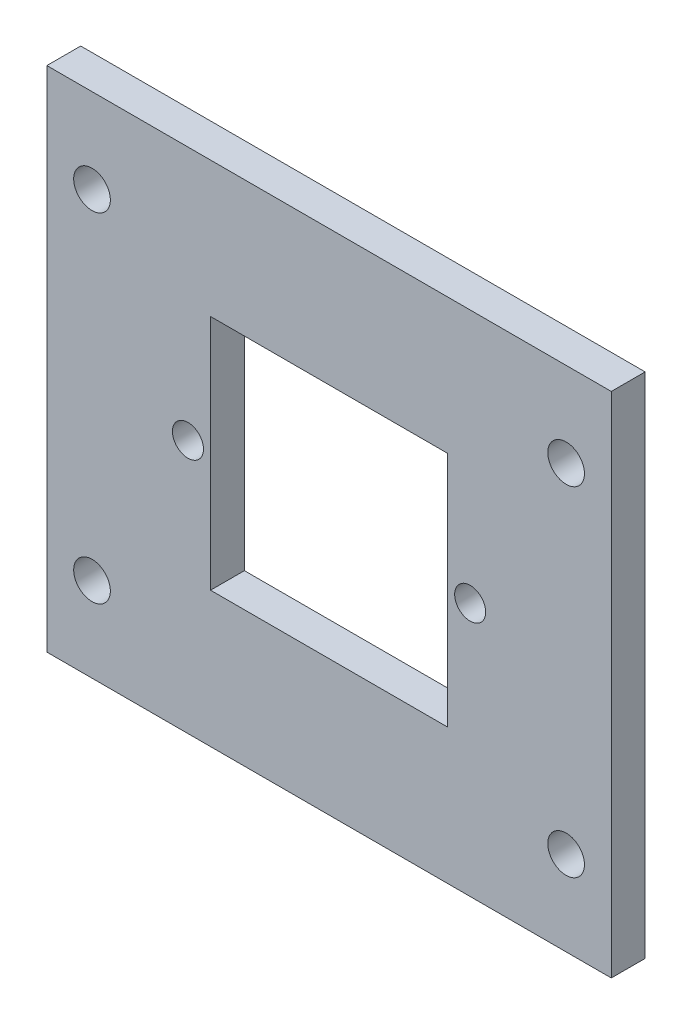
ISO-10303-21;
HEADER;
FILE_DESCRIPTION(('STEP AP214'),'2;1');
FILE_NAME('part.step','',(''),(''),'','','');
FILE_SCHEMA(('AUTOMOTIVE_DESIGN { 1 0 10303 214 1 1 1 1 }'));
ENDSEC;
DATA;
#1=APPLICATION_CONTEXT('core data for automotive mechanical design processes');
#2=APPLICATION_PROTOCOL_DEFINITION('international standard','automotive_design',2000,#1);
#3=PRODUCT_CONTEXT('',#1,'mechanical');
#4=PRODUCT('Part','Part','',(#3));
#5=PRODUCT_RELATED_PRODUCT_CATEGORY('part','',(#4));
#6=PRODUCT_DEFINITION_FORMATION('','',#4);
#7=PRODUCT_DEFINITION_CONTEXT('part definition',#1,'design');
#8=PRODUCT_DEFINITION('design','',#6,#7);
#9=PRODUCT_DEFINITION_SHAPE('','',#8);
#10=(LENGTH_UNIT() NAMED_UNIT(*) SI_UNIT(.MILLI.,.METRE.));
#11=(NAMED_UNIT(*) PLANE_ANGLE_UNIT() SI_UNIT($,.RADIAN.));
#12=(NAMED_UNIT(*) SI_UNIT($,.STERADIAN.) SOLID_ANGLE_UNIT());
#13=UNCERTAINTY_MEASURE_WITH_UNIT(LENGTH_MEASURE(1.E-05),#10,'distance_accuracy_value','');
#14=(GEOMETRIC_REPRESENTATION_CONTEXT(3) GLOBAL_UNCERTAINTY_ASSIGNED_CONTEXT((#13)) GLOBAL_UNIT_ASSIGNED_CONTEXT((#10,
#11,#12)) REPRESENTATION_CONTEXT('',''));
#15=CARTESIAN_POINT('',(0.,0.,0.));
#16=DIRECTION('',(0.,0.,1.));
#17=DIRECTION('',(1.,0.,0.));
#18=AXIS2_PLACEMENT_3D('',#15,#16,#17);
#19=CARTESIAN_POINT('',(-50.,45.,6.));
#20=DIRECTION('',(1.,0.,0.));
#21=DIRECTION('',(0.,1.,0.));
#22=AXIS2_PLACEMENT_3D('',#19,#20,#21);
#23=PLANE('',#22);
#24=DIRECTION('',(0.,-1.,0.));
#25=VECTOR('',#24,1.);
#26=CARTESIAN_POINT('',(-50.,45.,0.));
#27=LINE('',#26,#25);
#28=CARTESIAN_POINT('',(-50.,45.,0.));
#29=VERTEX_POINT('',#28);
#30=CARTESIAN_POINT('',(-50.,-45.,0.));
#31=VERTEX_POINT('',#30);
#32=EDGE_CURVE('E189',#29,#31,#27,.T.);
#33=ORIENTED_EDGE('',*,*,#32,.T.);
#34=DIRECTION('',(0.,0.,-1.));
#35=VECTOR('',#34,1.);
#36=CARTESIAN_POINT('',(-50.,-45.,6.));
#37=LINE('',#36,#35);
#38=CARTESIAN_POINT('',(-50.,-45.,6.));
#39=VERTEX_POINT('',#38);
#40=EDGE_CURVE('E227',#39,#31,#37,.T.);
#41=ORIENTED_EDGE('',*,*,#40,.F.);
#42=DIRECTION('',(0.,-1.,0.));
#43=VECTOR('',#42,1.);
#44=CARTESIAN_POINT('',(-50.,45.,6.));
#45=LINE('',#44,#43);
#46=CARTESIAN_POINT('',(-50.,45.,6.));
#47=VERTEX_POINT('',#46);
#48=EDGE_CURVE('E195',#47,#39,#45,.T.);
#49=ORIENTED_EDGE('',*,*,#48,.F.);
#50=DIRECTION('',(0.,0.,-1.));
#51=VECTOR('',#50,1.);
#52=CARTESIAN_POINT('',(-50.,45.,6.));
#53=LINE('',#52,#51);
#54=EDGE_CURVE('E210',#47,#29,#53,.T.);
#55=ORIENTED_EDGE('',*,*,#54,.T.);
#56=EDGE_LOOP('',(#33,#41,#49,#55));
#57=FACE_BOUND('',#56,.T.);
#58=ADVANCED_FACE('F44',(#57),#23,.F.);
#59=CARTESIAN_POINT('',(50.,-45.,6.));
#60=DIRECTION('',(0.,1.,0.));
#61=DIRECTION('',(-1.,0.,0.));
#62=AXIS2_PLACEMENT_3D('',#59,#60,#61);
#63=PLANE('',#62);
#64=DIRECTION('',(1.,0.,0.));
#65=VECTOR('',#64,1.);
#66=CARTESIAN_POINT('',(50.,-45.,0.));
#67=LINE('',#66,#65);
#68=CARTESIAN_POINT('',(50.,-45.,0.));
#69=VERTEX_POINT('',#68);
#70=EDGE_CURVE('E211',#31,#69,#67,.T.);
#71=ORIENTED_EDGE('',*,*,#70,.T.);
#72=DIRECTION('',(0.,0.,-1.));
#73=VECTOR('',#72,1.);
#74=CARTESIAN_POINT('',(50.,-45.,6.));
#75=LINE('',#74,#73);
#76=CARTESIAN_POINT('',(50.,-45.,6.));
#77=VERTEX_POINT('',#76);
#78=EDGE_CURVE('E228',#77,#69,#75,.T.);
#79=ORIENTED_EDGE('',*,*,#78,.F.);
#80=DIRECTION('',(1.,0.,0.));
#81=VECTOR('',#80,1.);
#82=CARTESIAN_POINT('',(50.,-45.,6.));
#83=LINE('',#82,#81);
#84=EDGE_CURVE('E197',#39,#77,#83,.T.);
#85=ORIENTED_EDGE('',*,*,#84,.F.);
#86=ORIENTED_EDGE('',*,*,#40,.T.);
#87=EDGE_LOOP('',(#71,#79,#85,#86));
#88=FACE_BOUND('',#87,.T.);
#89=ADVANCED_FACE('F262',(#88),#63,.F.);
#90=CARTESIAN_POINT('',(50.,45.,6.));
#91=DIRECTION('',(-1.,0.,0.));
#92=DIRECTION('',(0.,-1.,0.));
#93=AXIS2_PLACEMENT_3D('',#90,#91,#92);
#94=PLANE('',#93);
#95=DIRECTION('',(0.,1.,0.));
#96=VECTOR('',#95,1.);
#97=CARTESIAN_POINT('',(50.,45.,0.));
#98=LINE('',#97,#96);
#99=CARTESIAN_POINT('',(50.,45.,0.));
#100=VERTEX_POINT('',#99);
#101=EDGE_CURVE('E212',#69,#100,#98,.T.);
#102=ORIENTED_EDGE('',*,*,#101,.T.);
#103=DIRECTION('',(0.,0.,-1.));
#104=VECTOR('',#103,1.);
#105=CARTESIAN_POINT('',(50.,45.,6.));
#106=LINE('',#105,#104);
#107=CARTESIAN_POINT('',(50.,45.,6.));
#108=VERTEX_POINT('',#107);
#109=EDGE_CURVE('E225',#108,#100,#106,.T.);
#110=ORIENTED_EDGE('',*,*,#109,.F.);
#111=DIRECTION('',(0.,1.,0.));
#112=VECTOR('',#111,1.);
#113=CARTESIAN_POINT('',(50.,45.,6.));
#114=LINE('',#113,#112);
#115=EDGE_CURVE('E203',#77,#108,#114,.T.);
#116=ORIENTED_EDGE('',*,*,#115,.F.);
#117=ORIENTED_EDGE('',*,*,#78,.T.);
#118=EDGE_LOOP('',(#102,#110,#116,#117));
#119=FACE_BOUND('',#118,.T.);
#120=ADVANCED_FACE('F267',(#119),#94,.F.);
#121=CARTESIAN_POINT('',(50.,45.,6.));
#122=DIRECTION('',(0.,-1.,0.));
#123=DIRECTION('',(1.,0.,0.));
#124=AXIS2_PLACEMENT_3D('',#121,#122,#123);
#125=PLANE('',#124);
#126=DIRECTION('',(-1.,0.,0.));
#127=VECTOR('',#126,1.);
#128=CARTESIAN_POINT('',(50.,45.,0.));
#129=LINE('',#128,#127);
#130=EDGE_CURVE('E196',#100,#29,#129,.T.);
#131=ORIENTED_EDGE('',*,*,#130,.T.);
#132=ORIENTED_EDGE('',*,*,#54,.F.);
#133=DIRECTION('',(-1.,0.,0.));
#134=VECTOR('',#133,1.);
#135=CARTESIAN_POINT('',(50.,45.,6.));
#136=LINE('',#135,#134);
#137=EDGE_CURVE('E204',#108,#47,#136,.T.);
#138=ORIENTED_EDGE('',*,*,#137,.F.);
#139=ORIENTED_EDGE('',*,*,#109,.T.);
#140=EDGE_LOOP('',(#131,#132,#138,#139));
#141=FACE_BOUND('',#140,.T.);
#142=ADVANCED_FACE('F284',(#141),#125,.F.);
#143=CARTESIAN_POINT('',(0.,0.,6.));
#144=DIRECTION('',(0.,0.,-1.));
#145=DIRECTION('',(-1.,0.,0.));
#146=AXIS2_PLACEMENT_3D('',#143,#144,#145);
#147=PLANE('',#146);
#148=DIRECTION('',(1.,0.,0.));
#149=VECTOR('',#148,1.);
#150=CARTESIAN_POINT('',(21.,-21.,6.));
#151=LINE('',#150,#149);
#152=CARTESIAN_POINT('',(-21.,-21.,6.));
#153=VERTEX_POINT('',#152);
#154=CARTESIAN_POINT('',(21.,-21.,6.));
#155=VERTEX_POINT('',#154);
#156=EDGE_CURVE('E124',#153,#155,#151,.T.);
#157=ORIENTED_EDGE('',*,*,#156,.F.);
#158=DIRECTION('',(0.,-1.,0.));
#159=VECTOR('',#158,1.);
#160=CARTESIAN_POINT('',(-21.,21.,6.));
#161=LINE('',#160,#159);
#162=CARTESIAN_POINT('',(-21.,21.,6.));
#163=VERTEX_POINT('',#162);
#164=EDGE_CURVE('E58',#163,#153,#161,.T.);
#165=ORIENTED_EDGE('',*,*,#164,.F.);
#166=DIRECTION('',(-1.,0.,0.));
#167=VECTOR('',#166,1.);
#168=CARTESIAN_POINT('',(21.,21.,6.));
#169=LINE('',#168,#167);
#170=CARTESIAN_POINT('',(21.,21.,6.));
#171=VERTEX_POINT('',#170);
#172=EDGE_CURVE('E128',#171,#163,#169,.T.);
#173=ORIENTED_EDGE('',*,*,#172,.F.);
#174=DIRECTION('',(0.,1.,0.));
#175=VECTOR('',#174,1.);
#176=CARTESIAN_POINT('',(21.,21.,6.));
#177=LINE('',#176,#175);
#178=EDGE_CURVE('E115',#155,#171,#177,.T.);
#179=ORIENTED_EDGE('',*,*,#178,.F.);
#180=EDGE_LOOP('',(#157,#165,#173,#179));
#181=FACE_BOUND('',#180,.T.);
#182=CARTESIAN_POINT('',(-42.,30.,6.));
#183=DIRECTION('',(0.,0.,1.));
#184=DIRECTION('',(1.,0.,0.));
#185=AXIS2_PLACEMENT_3D('',#182,#183,#184);
#186=CIRCLE('',#185,3.25);
#187=CARTESIAN_POINT('',(-38.75,30.,6.));
#188=VERTEX_POINT('',#187);
#189=EDGE_CURVE('E153',#188,#188,#186,.T.);
#190=ORIENTED_EDGE('',*,*,#189,.F.);
#191=EDGE_LOOP('',(#190));
#192=FACE_BOUND('',#191,.T.);
#193=CARTESIAN_POINT('',(-42.,-30.,6.));
#194=DIRECTION('',(0.,0.,1.));
#195=DIRECTION('',(-1.,0.,0.));
#196=AXIS2_PLACEMENT_3D('',#193,#194,#195);
#197=CIRCLE('',#196,3.25);
#198=CARTESIAN_POINT('',(-45.25,-30.,6.));
#199=VERTEX_POINT('',#198);
#200=EDGE_CURVE('E165',#199,#199,#197,.T.);
#201=ORIENTED_EDGE('',*,*,#200,.F.);
#202=EDGE_LOOP('',(#201));
#203=FACE_BOUND('',#202,.T.);
#204=CARTESIAN_POINT('',(42.,-30.,6.));
#205=DIRECTION('',(0.,0.,1.));
#206=DIRECTION('',(1.,0.,0.));
#207=AXIS2_PLACEMENT_3D('',#204,#205,#206);
#208=CIRCLE('',#207,3.25);
#209=CARTESIAN_POINT('',(45.25,-30.,6.));
#210=VERTEX_POINT('',#209);
#211=EDGE_CURVE('E168',#210,#210,#208,.T.);
#212=ORIENTED_EDGE('',*,*,#211,.F.);
#213=EDGE_LOOP('',(#212));
#214=FACE_BOUND('',#213,.T.);
#215=CARTESIAN_POINT('',(25.,0.,6.));
#216=DIRECTION('',(0.,0.,1.));
#217=DIRECTION('',(-1.,0.,0.));
#218=AXIS2_PLACEMENT_3D('',#215,#216,#217);
#219=CIRCLE('',#218,2.75);
#220=CARTESIAN_POINT('',(22.25,0.,6.));
#221=VERTEX_POINT('',#220);
#222=EDGE_CURVE('E180',#221,#221,#219,.T.);
#223=ORIENTED_EDGE('',*,*,#222,.F.);
#224=EDGE_LOOP('',(#223));
#225=FACE_BOUND('',#224,.T.);
#226=CARTESIAN_POINT('',(42.,30.,6.));
#227=DIRECTION('',(0.,0.,1.));
#228=DIRECTION('',(-1.,0.,0.));
#229=AXIS2_PLACEMENT_3D('',#226,#227,#228);
#230=CIRCLE('',#229,3.25);
#231=CARTESIAN_POINT('',(38.75,30.,6.));
#232=VERTEX_POINT('',#231);
#233=EDGE_CURVE('E144',#232,#232,#230,.T.);
#234=ORIENTED_EDGE('',*,*,#233,.F.);
#235=EDGE_LOOP('',(#234));
#236=FACE_BOUND('',#235,.T.);
#237=CARTESIAN_POINT('',(-25.,0.,6.));
#238=DIRECTION('',(0.,0.,1.));
#239=DIRECTION('',(1.,0.,0.));
#240=AXIS2_PLACEMENT_3D('',#237,#238,#239);
#241=CIRCLE('',#240,2.75);
#242=CARTESIAN_POINT('',(-22.25,0.,6.));
#243=VERTEX_POINT('',#242);
#244=EDGE_CURVE('E160',#243,#243,#241,.T.);
#245=ORIENTED_EDGE('',*,*,#244,.F.);
#246=EDGE_LOOP('',(#245));
#247=FACE_BOUND('',#246,.T.);
#248=ORIENTED_EDGE('',*,*,#48,.T.);
#249=ORIENTED_EDGE('',*,*,#84,.T.);
#250=ORIENTED_EDGE('',*,*,#115,.T.);
#251=ORIENTED_EDGE('',*,*,#137,.T.);
#252=EDGE_LOOP('',(#248,#249,#250,#251));
#253=FACE_BOUND('',#252,.T.);
#254=ADVANCED_FACE('F130',(#181,#192,#203,#214,#225,#236,#247,#253),#147,.F.);
#255=CARTESIAN_POINT('',(0.,0.,0.));
#256=DIRECTION('',(0.,0.,-1.));
#257=DIRECTION('',(-1.,0.,0.));
#258=AXIS2_PLACEMENT_3D('',#255,#256,#257);
#259=PLANE('',#258);
#260=DIRECTION('',(0.,1.,0.));
#261=VECTOR('',#260,1.);
#262=CARTESIAN_POINT('',(-21.,0.,0.));
#263=LINE('',#262,#261);
#264=CARTESIAN_POINT('',(-21.,-21.,0.));
#265=VERTEX_POINT('',#264);
#266=CARTESIAN_POINT('',(-21.,21.,0.));
#267=VERTEX_POINT('',#266);
#268=EDGE_CURVE('E11',#265,#267,#263,.T.);
#269=ORIENTED_EDGE('',*,*,#268,.F.);
#270=DIRECTION('',(-1.,0.,0.));
#271=VECTOR('',#270,1.);
#272=CARTESIAN_POINT('',(0.,-21.,0.));
#273=LINE('',#272,#271);
#274=CARTESIAN_POINT('',(21.,-21.,0.));
#275=VERTEX_POINT('',#274);
#276=EDGE_CURVE('E231',#275,#265,#273,.T.);
#277=ORIENTED_EDGE('',*,*,#276,.F.);
#278=DIRECTION('',(0.,-1.,0.));
#279=VECTOR('',#278,1.);
#280=CARTESIAN_POINT('',(21.,0.,0.));
#281=LINE('',#280,#279);
#282=CARTESIAN_POINT('',(21.,21.,0.));
#283=VERTEX_POINT('',#282);
#284=EDGE_CURVE('E113',#283,#275,#281,.T.);
#285=ORIENTED_EDGE('',*,*,#284,.F.);
#286=DIRECTION('',(1.,0.,0.));
#287=VECTOR('',#286,1.);
#288=CARTESIAN_POINT('',(0.,21.,0.));
#289=LINE('',#288,#287);
#290=EDGE_CURVE('E52',#267,#283,#289,.T.);
#291=ORIENTED_EDGE('',*,*,#290,.F.);
#292=EDGE_LOOP('',(#269,#277,#285,#291));
#293=FACE_BOUND('',#292,.T.);
#294=CARTESIAN_POINT('',(-42.,30.,0.));
#295=DIRECTION('',(0.,0.,1.));
#296=DIRECTION('',(1.,0.,0.));
#297=AXIS2_PLACEMENT_3D('',#294,#295,#296);
#298=CIRCLE('',#297,3.25);
#299=CARTESIAN_POINT('',(-38.75,30.,0.));
#300=VERTEX_POINT('',#299);
#301=EDGE_CURVE('E158',#300,#300,#298,.T.);
#302=ORIENTED_EDGE('',*,*,#301,.T.);
#303=EDGE_LOOP('',(#302));
#304=FACE_BOUND('',#303,.T.);
#305=CARTESIAN_POINT('',(-42.,-30.,0.));
#306=DIRECTION('',(0.,0.,1.));
#307=DIRECTION('',(-1.,0.,0.));
#308=AXIS2_PLACEMENT_3D('',#305,#306,#307);
#309=CIRCLE('',#308,3.25);
#310=CARTESIAN_POINT('',(-45.25,-30.,0.));
#311=VERTEX_POINT('',#310);
#312=EDGE_CURVE('E167',#311,#311,#309,.T.);
#313=ORIENTED_EDGE('',*,*,#312,.T.);
#314=EDGE_LOOP('',(#313));
#315=FACE_BOUND('',#314,.T.);
#316=CARTESIAN_POINT('',(42.,-30.,0.));
#317=DIRECTION('',(0.,0.,1.));
#318=DIRECTION('',(1.,0.,0.));
#319=AXIS2_PLACEMENT_3D('',#316,#317,#318);
#320=CIRCLE('',#319,3.25);
#321=CARTESIAN_POINT('',(45.25,-30.,0.));
#322=VERTEX_POINT('',#321);
#323=EDGE_CURVE('E174',#322,#322,#320,.T.);
#324=ORIENTED_EDGE('',*,*,#323,.T.);
#325=EDGE_LOOP('',(#324));
#326=FACE_BOUND('',#325,.T.);
#327=CARTESIAN_POINT('',(25.,0.,0.));
#328=DIRECTION('',(0.,0.,1.));
#329=DIRECTION('',(-1.,0.,0.));
#330=AXIS2_PLACEMENT_3D('',#327,#328,#329);
#331=CIRCLE('',#330,2.75);
#332=CARTESIAN_POINT('',(22.25,0.,0.));
#333=VERTEX_POINT('',#332);
#334=EDGE_CURVE('E149',#333,#333,#331,.T.);
#335=ORIENTED_EDGE('',*,*,#334,.T.);
#336=EDGE_LOOP('',(#335));
#337=FACE_BOUND('',#336,.T.);
#338=CARTESIAN_POINT('',(42.,30.,0.));
#339=DIRECTION('',(0.,0.,1.));
#340=DIRECTION('',(-1.,0.,0.));
#341=AXIS2_PLACEMENT_3D('',#338,#339,#340);
#342=CIRCLE('',#341,3.25);
#343=CARTESIAN_POINT('',(38.75,30.,0.));
#344=VERTEX_POINT('',#343);
#345=EDGE_CURVE('E138',#344,#344,#342,.T.);
#346=ORIENTED_EDGE('',*,*,#345,.T.);
#347=EDGE_LOOP('',(#346));
#348=FACE_BOUND('',#347,.T.);
#349=CARTESIAN_POINT('',(-25.,0.,0.));
#350=DIRECTION('',(0.,0.,1.));
#351=DIRECTION('',(1.,0.,0.));
#352=AXIS2_PLACEMENT_3D('',#349,#350,#351);
#353=CIRCLE('',#352,2.75);
#354=CARTESIAN_POINT('',(-22.25,0.,0.));
#355=VERTEX_POINT('',#354);
#356=EDGE_CURVE('E183',#355,#355,#353,.T.);
#357=ORIENTED_EDGE('',*,*,#356,.T.);
#358=EDGE_LOOP('',(#357));
#359=FACE_BOUND('',#358,.T.);
#360=ORIENTED_EDGE('',*,*,#32,.F.);
#361=ORIENTED_EDGE('',*,*,#130,.F.);
#362=ORIENTED_EDGE('',*,*,#101,.F.);
#363=ORIENTED_EDGE('',*,*,#70,.F.);
#364=EDGE_LOOP('',(#360,#361,#362,#363));
#365=FACE_BOUND('',#364,.T.);
#366=ADVANCED_FACE('F242',(#293,#304,#315,#326,#337,#348,#359,#365),#259,.T.);
#367=CARTESIAN_POINT('',(-25.,0.,0.));
#368=DIRECTION('',(0.,0.,1.));
#369=DIRECTION('',(1.,0.,0.));
#370=AXIS2_PLACEMENT_3D('',#367,#368,#369);
#371=CYLINDRICAL_SURFACE('',#370,2.75);
#372=ORIENTED_EDGE('',*,*,#356,.F.);
#373=EDGE_LOOP('',(#372));
#374=FACE_BOUND('',#373,.T.);
#375=ORIENTED_EDGE('',*,*,#244,.T.);
#376=EDGE_LOOP('',(#375));
#377=FACE_BOUND('',#376,.T.);
#378=ADVANCED_FACE('F294',(#374,#377),#371,.F.);
#379=CARTESIAN_POINT('',(42.,30.,0.));
#380=DIRECTION('',(0.,0.,1.));
#381=DIRECTION('',(1.,0.,0.));
#382=AXIS2_PLACEMENT_3D('',#379,#380,#381);
#383=CYLINDRICAL_SURFACE('',#382,3.25);
#384=ORIENTED_EDGE('',*,*,#345,.F.);
#385=EDGE_LOOP('',(#384));
#386=FACE_BOUND('',#385,.T.);
#387=ORIENTED_EDGE('',*,*,#233,.T.);
#388=EDGE_LOOP('',(#387));
#389=FACE_BOUND('',#388,.T.);
#390=ADVANCED_FACE('F299',(#386,#389),#383,.F.);
#391=CARTESIAN_POINT('',(25.,0.,0.));
#392=DIRECTION('',(0.,0.,1.));
#393=DIRECTION('',(1.,0.,0.));
#394=AXIS2_PLACEMENT_3D('',#391,#392,#393);
#395=CYLINDRICAL_SURFACE('',#394,2.75);
#396=ORIENTED_EDGE('',*,*,#334,.F.);
#397=EDGE_LOOP('',(#396));
#398=FACE_BOUND('',#397,.T.);
#399=ORIENTED_EDGE('',*,*,#222,.T.);
#400=EDGE_LOOP('',(#399));
#401=FACE_BOUND('',#400,.T.);
#402=ADVANCED_FACE('F302',(#398,#401),#395,.F.);
#403=CARTESIAN_POINT('',(42.,-30.,0.));
#404=DIRECTION('',(0.,0.,1.));
#405=DIRECTION('',(1.,0.,0.));
#406=AXIS2_PLACEMENT_3D('',#403,#404,#405);
#407=CYLINDRICAL_SURFACE('',#406,3.25);
#408=ORIENTED_EDGE('',*,*,#323,.F.);
#409=EDGE_LOOP('',(#408));
#410=FACE_BOUND('',#409,.T.);
#411=ORIENTED_EDGE('',*,*,#211,.T.);
#412=EDGE_LOOP('',(#411));
#413=FACE_BOUND('',#412,.T.);
#414=ADVANCED_FACE('F301',(#410,#413),#407,.F.);
#415=CARTESIAN_POINT('',(-42.,-30.,0.));
#416=DIRECTION('',(0.,0.,1.));
#417=DIRECTION('',(1.,0.,0.));
#418=AXIS2_PLACEMENT_3D('',#415,#416,#417);
#419=CYLINDRICAL_SURFACE('',#418,3.25);
#420=ORIENTED_EDGE('',*,*,#312,.F.);
#421=EDGE_LOOP('',(#420));
#422=FACE_BOUND('',#421,.T.);
#423=ORIENTED_EDGE('',*,*,#200,.T.);
#424=EDGE_LOOP('',(#423));
#425=FACE_BOUND('',#424,.T.);
#426=ADVANCED_FACE('F256',(#422,#425),#419,.F.);
#427=CARTESIAN_POINT('',(-42.,30.,0.));
#428=DIRECTION('',(0.,0.,1.));
#429=DIRECTION('',(1.,0.,0.));
#430=AXIS2_PLACEMENT_3D('',#427,#428,#429);
#431=CYLINDRICAL_SURFACE('',#430,3.25);
#432=ORIENTED_EDGE('',*,*,#301,.F.);
#433=EDGE_LOOP('',(#432));
#434=FACE_BOUND('',#433,.T.);
#435=ORIENTED_EDGE('',*,*,#189,.T.);
#436=EDGE_LOOP('',(#435));
#437=FACE_BOUND('',#436,.T.);
#438=ADVANCED_FACE('F248',(#434,#437),#431,.F.);
#439=CARTESIAN_POINT('',(-21.,21.,-4.));
#440=DIRECTION('',(-1.,0.,0.));
#441=DIRECTION('',(0.,0.,1.));
#442=AXIS2_PLACEMENT_3D('',#439,#440,#441);
#443=PLANE('',#442);
#444=ORIENTED_EDGE('',*,*,#268,.T.);
#445=DIRECTION('',(0.,0.,1.));
#446=VECTOR('',#445,1.);
#447=CARTESIAN_POINT('',(-21.,21.,-4.));
#448=LINE('',#447,#446);
#449=EDGE_CURVE('E139',#267,#163,#448,.T.);
#450=ORIENTED_EDGE('',*,*,#449,.T.);
#451=ORIENTED_EDGE('',*,*,#164,.T.);
#452=DIRECTION('',(0.,0.,1.));
#453=VECTOR('',#452,1.);
#454=CARTESIAN_POINT('',(-21.,-21.,-4.));
#455=LINE('',#454,#453);
#456=EDGE_CURVE('E119',#265,#153,#455,.T.);
#457=ORIENTED_EDGE('',*,*,#456,.F.);
#458=EDGE_LOOP('',(#444,#450,#451,#457));
#459=FACE_BOUND('',#458,.T.);
#460=ADVANCED_FACE('F249',(#459),#443,.F.);
#461=CARTESIAN_POINT('',(21.,21.,-4.));
#462=DIRECTION('',(0.,1.,0.));
#463=DIRECTION('',(-1.,0.,0.));
#464=AXIS2_PLACEMENT_3D('',#461,#462,#463);
#465=PLANE('',#464);
#466=ORIENTED_EDGE('',*,*,#290,.T.);
#467=DIRECTION('',(0.,0.,1.));
#468=VECTOR('',#467,1.);
#469=CARTESIAN_POINT('',(21.,21.,-4.));
#470=LINE('',#469,#468);
#471=EDGE_CURVE('E116',#283,#171,#470,.T.);
#472=ORIENTED_EDGE('',*,*,#471,.T.);
#473=ORIENTED_EDGE('',*,*,#172,.T.);
#474=ORIENTED_EDGE('',*,*,#449,.F.);
#475=EDGE_LOOP('',(#466,#472,#473,#474));
#476=FACE_BOUND('',#475,.T.);
#477=ADVANCED_FACE('F245',(#476),#465,.F.);
#478=CARTESIAN_POINT('',(21.,21.,-4.));
#479=DIRECTION('',(1.,0.,0.));
#480=DIRECTION('',(0.,1.,0.));
#481=AXIS2_PLACEMENT_3D('',#478,#479,#480);
#482=PLANE('',#481);
#483=ORIENTED_EDGE('',*,*,#284,.T.);
#484=DIRECTION('',(0.,0.,1.));
#485=VECTOR('',#484,1.);
#486=CARTESIAN_POINT('',(21.,-21.,-4.));
#487=LINE('',#486,#485);
#488=EDGE_CURVE('E70',#275,#155,#487,.T.);
#489=ORIENTED_EDGE('',*,*,#488,.T.);
#490=ORIENTED_EDGE('',*,*,#178,.T.);
#491=ORIENTED_EDGE('',*,*,#471,.F.);
#492=EDGE_LOOP('',(#483,#489,#490,#491));
#493=FACE_BOUND('',#492,.T.);
#494=ADVANCED_FACE('F108',(#493),#482,.F.);
#495=CARTESIAN_POINT('',(21.,-21.,-4.));
#496=DIRECTION('',(0.,-1.,0.));
#497=DIRECTION('',(1.,0.,0.));
#498=AXIS2_PLACEMENT_3D('',#495,#496,#497);
#499=PLANE('',#498);
#500=ORIENTED_EDGE('',*,*,#276,.T.);
#501=ORIENTED_EDGE('',*,*,#456,.T.);
#502=ORIENTED_EDGE('',*,*,#156,.T.);
#503=ORIENTED_EDGE('',*,*,#488,.F.);
#504=EDGE_LOOP('',(#500,#501,#502,#503));
#505=FACE_BOUND('',#504,.T.);
#506=ADVANCED_FACE('F125',(#505),#499,.F.);
#507=CLOSED_SHELL('',(#58,#89,#120,#142,#254,#366,#378,#390,#402,#414,#426,#438,#460,#477,#494,#506));
#508=MANIFOLD_SOLID_BREP('B2',#507);
#509=ADVANCED_BREP_SHAPE_REPRESENTATION('',(#18,#508),#14);
#510=SHAPE_DEFINITION_REPRESENTATION(#9,#509);
ENDSEC;
END-ISO-10303-21;
